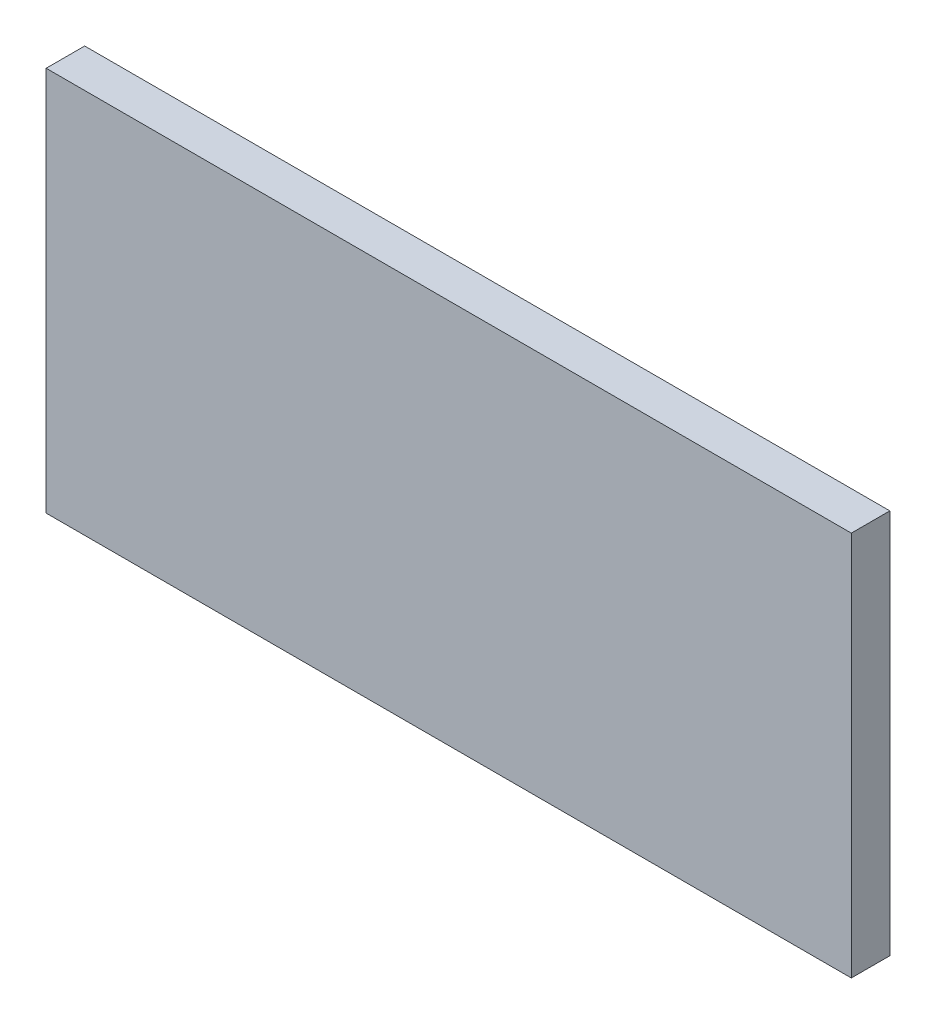
ISO-10303-21;
HEADER;
FILE_DESCRIPTION(('STEP AP214'),'2;1');
FILE_NAME('part.step','',(''),(''),'','','');
FILE_SCHEMA(('AUTOMOTIVE_DESIGN { 1 0 10303 214 1 1 1 1 }'));
ENDSEC;
DATA;
#1=APPLICATION_CONTEXT('core data for automotive mechanical design processes');
#2=APPLICATION_PROTOCOL_DEFINITION('international standard','automotive_design',2000,#1);
#3=PRODUCT_CONTEXT('',#1,'mechanical');
#4=PRODUCT('Part','Part','',(#3));
#5=PRODUCT_RELATED_PRODUCT_CATEGORY('part','',(#4));
#6=PRODUCT_DEFINITION_FORMATION('','',#4);
#7=PRODUCT_DEFINITION_CONTEXT('part definition',#1,'design');
#8=PRODUCT_DEFINITION('design','',#6,#7);
#9=PRODUCT_DEFINITION_SHAPE('','',#8);
#10=(LENGTH_UNIT() NAMED_UNIT(*) SI_UNIT(.MILLI.,.METRE.));
#11=(NAMED_UNIT(*) PLANE_ANGLE_UNIT() SI_UNIT($,.RADIAN.));
#12=(NAMED_UNIT(*) SI_UNIT($,.STERADIAN.) SOLID_ANGLE_UNIT());
#13=UNCERTAINTY_MEASURE_WITH_UNIT(LENGTH_MEASURE(1.E-05),#10,'distance_accuracy_value','');
#14=(GEOMETRIC_REPRESENTATION_CONTEXT(3) GLOBAL_UNCERTAINTY_ASSIGNED_CONTEXT((#13)) GLOBAL_UNIT_ASSIGNED_CONTEXT((#10,
#11,#12)) REPRESENTATION_CONTEXT('',''));
#15=CARTESIAN_POINT('',(0.,0.,0.));
#16=DIRECTION('',(0.,0.,1.));
#17=DIRECTION('',(1.,0.,0.));
#18=AXIS2_PLACEMENT_3D('',#15,#16,#17);
#19=CARTESIAN_POINT('',(-33.17494,-15.875,3.175));
#20=DIRECTION('',(1.,0.,0.));
#21=DIRECTION('',(0.,0.,-1.));
#22=AXIS2_PLACEMENT_3D('',#19,#20,#21);
#23=PLANE('',#22);
#24=DIRECTION('',(0.,-1.,0.));
#25=VECTOR('',#24,1.);
#26=CARTESIAN_POINT('',(-33.17494,-15.875,0.));
#27=LINE('',#26,#25);
#28=CARTESIAN_POINT('',(-33.17494,15.875,0.));
#29=VERTEX_POINT('',#28);
#30=CARTESIAN_POINT('',(-33.17494,-15.875,0.));
#31=VERTEX_POINT('',#30);
#32=EDGE_CURVE('E99',#29,#31,#27,.T.);
#33=ORIENTED_EDGE('',*,*,#32,.T.);
#34=DIRECTION('',(0.,0.,-1.));
#35=VECTOR('',#34,1.);
#36=CARTESIAN_POINT('',(-33.17494,-15.875,3.175));
#37=LINE('',#36,#35);
#38=CARTESIAN_POINT('',(-33.17494,-15.875,3.175));
#39=VERTEX_POINT('',#38);
#40=EDGE_CURVE('E11',#39,#31,#37,.T.);
#41=ORIENTED_EDGE('',*,*,#40,.F.);
#42=DIRECTION('',(0.,-1.,0.));
#43=VECTOR('',#42,1.);
#44=CARTESIAN_POINT('',(-33.17494,-15.875,3.175));
#45=LINE('',#44,#43);
#46=CARTESIAN_POINT('',(-33.17494,15.875,3.175));
#47=VERTEX_POINT('',#46);
#48=EDGE_CURVE('E87',#47,#39,#45,.T.);
#49=ORIENTED_EDGE('',*,*,#48,.F.);
#50=DIRECTION('',(0.,0.,-1.));
#51=VECTOR('',#50,1.);
#52=CARTESIAN_POINT('',(-33.17494,15.875,3.175));
#53=LINE('',#52,#51);
#54=EDGE_CURVE('E95',#47,#29,#53,.T.);
#55=ORIENTED_EDGE('',*,*,#54,.T.);
#56=EDGE_LOOP('',(#33,#41,#49,#55));
#57=FACE_BOUND('',#56,.T.);
#58=ADVANCED_FACE('F36',(#57),#23,.F.);
#59=CARTESIAN_POINT('',(33.17494,-15.875,3.175));
#60=DIRECTION('',(0.,1.,0.));
#61=DIRECTION('',(-1.,0.,0.));
#62=AXIS2_PLACEMENT_3D('',#59,#60,#61);
#63=PLANE('',#62);
#64=DIRECTION('',(1.,0.,0.));
#65=VECTOR('',#64,1.);
#66=CARTESIAN_POINT('',(33.17494,-15.875,0.));
#67=LINE('',#66,#65);
#68=CARTESIAN_POINT('',(33.17494,-15.875,0.));
#69=VERTEX_POINT('',#68);
#70=EDGE_CURVE('E91',#31,#69,#67,.T.);
#71=ORIENTED_EDGE('',*,*,#70,.T.);
#72=DIRECTION('',(0.,0.,-1.));
#73=VECTOR('',#72,1.);
#74=CARTESIAN_POINT('',(33.17494,-15.875,3.175));
#75=LINE('',#74,#73);
#76=CARTESIAN_POINT('',(33.17494,-15.875,3.175));
#77=VERTEX_POINT('',#76);
#78=EDGE_CURVE('E44',#77,#69,#75,.T.);
#79=ORIENTED_EDGE('',*,*,#78,.F.);
#80=DIRECTION('',(1.,0.,0.));
#81=VECTOR('',#80,1.);
#82=CARTESIAN_POINT('',(33.17494,-15.875,3.175));
#83=LINE('',#82,#81);
#84=EDGE_CURVE('E82',#39,#77,#83,.T.);
#85=ORIENTED_EDGE('',*,*,#84,.F.);
#86=ORIENTED_EDGE('',*,*,#40,.T.);
#87=EDGE_LOOP('',(#71,#79,#85,#86));
#88=FACE_BOUND('',#87,.T.);
#89=ADVANCED_FACE('F90',(#88),#63,.F.);
#90=CARTESIAN_POINT('',(33.17494,-15.875,3.175));
#91=DIRECTION('',(-1.,0.,0.));
#92=DIRECTION('',(0.,0.,1.));
#93=AXIS2_PLACEMENT_3D('',#90,#91,#92);
#94=PLANE('',#93);
#95=DIRECTION('',(0.,1.,0.));
#96=VECTOR('',#95,1.);
#97=CARTESIAN_POINT('',(33.17494,-15.875,0.));
#98=LINE('',#97,#96);
#99=CARTESIAN_POINT('',(33.17494,15.875,0.));
#100=VERTEX_POINT('',#99);
#101=EDGE_CURVE('E69',#69,#100,#98,.T.);
#102=ORIENTED_EDGE('',*,*,#101,.T.);
#103=DIRECTION('',(0.,0.,-1.));
#104=VECTOR('',#103,1.);
#105=CARTESIAN_POINT('',(33.17494,15.875,3.175));
#106=LINE('',#105,#104);
#107=CARTESIAN_POINT('',(33.17494,15.875,3.175));
#108=VERTEX_POINT('',#107);
#109=EDGE_CURVE('E92',#108,#100,#106,.T.);
#110=ORIENTED_EDGE('',*,*,#109,.F.);
#111=DIRECTION('',(0.,1.,0.));
#112=VECTOR('',#111,1.);
#113=CARTESIAN_POINT('',(33.17494,-15.875,3.175));
#114=LINE('',#113,#112);
#115=EDGE_CURVE('E85',#77,#108,#114,.T.);
#116=ORIENTED_EDGE('',*,*,#115,.F.);
#117=ORIENTED_EDGE('',*,*,#78,.T.);
#118=EDGE_LOOP('',(#102,#110,#116,#117));
#119=FACE_BOUND('',#118,.T.);
#120=ADVANCED_FACE('F93',(#119),#94,.F.);
#121=CARTESIAN_POINT('',(33.17494,15.875,3.175));
#122=DIRECTION('',(0.,-1.,0.));
#123=DIRECTION('',(1.,0.,0.));
#124=AXIS2_PLACEMENT_3D('',#121,#122,#123);
#125=PLANE('',#124);
#126=DIRECTION('',(-1.,0.,0.));
#127=VECTOR('',#126,1.);
#128=CARTESIAN_POINT('',(33.17494,15.875,0.));
#129=LINE('',#128,#127);
#130=EDGE_CURVE('E75',#100,#29,#129,.T.);
#131=ORIENTED_EDGE('',*,*,#130,.T.);
#132=ORIENTED_EDGE('',*,*,#54,.F.);
#133=DIRECTION('',(-1.,0.,0.));
#134=VECTOR('',#133,1.);
#135=CARTESIAN_POINT('',(33.17494,15.875,3.175));
#136=LINE('',#135,#134);
#137=EDGE_CURVE('E52',#108,#47,#136,.T.);
#138=ORIENTED_EDGE('',*,*,#137,.F.);
#139=ORIENTED_EDGE('',*,*,#109,.T.);
#140=EDGE_LOOP('',(#131,#132,#138,#139));
#141=FACE_BOUND('',#140,.T.);
#142=ADVANCED_FACE('F106',(#141),#125,.F.);
#143=CARTESIAN_POINT('',(0.,0.,3.175));
#144=DIRECTION('',(0.,0.,1.));
#145=DIRECTION('',(1.,0.,0.));
#146=AXIS2_PLACEMENT_3D('',#143,#144,#145);
#147=PLANE('',#146);
#148=ORIENTED_EDGE('',*,*,#48,.T.);
#149=ORIENTED_EDGE('',*,*,#84,.T.);
#150=ORIENTED_EDGE('',*,*,#115,.T.);
#151=ORIENTED_EDGE('',*,*,#137,.T.);
#152=EDGE_LOOP('',(#148,#149,#150,#151));
#153=FACE_BOUND('',#152,.T.);
#154=ADVANCED_FACE('F83',(#153),#147,.T.);
#155=CARTESIAN_POINT('',(0.,0.,0.));
#156=DIRECTION('',(0.,0.,1.));
#157=DIRECTION('',(1.,0.,0.));
#158=AXIS2_PLACEMENT_3D('',#155,#156,#157);
#159=PLANE('',#158);
#160=ORIENTED_EDGE('',*,*,#32,.F.);
#161=ORIENTED_EDGE('',*,*,#130,.F.);
#162=ORIENTED_EDGE('',*,*,#101,.F.);
#163=ORIENTED_EDGE('',*,*,#70,.F.);
#164=EDGE_LOOP('',(#160,#161,#162,#163));
#165=FACE_BOUND('',#164,.T.);
#166=ADVANCED_FACE('F109',(#165),#159,.F.);
#167=CLOSED_SHELL('',(#58,#89,#120,#142,#154,#166));
#168=MANIFOLD_SOLID_BREP('B2',#167);
#169=ADVANCED_BREP_SHAPE_REPRESENTATION('',(#18,#168),#14);
#170=SHAPE_DEFINITION_REPRESENTATION(#9,#169);
ENDSEC;
END-ISO-10303-21;
